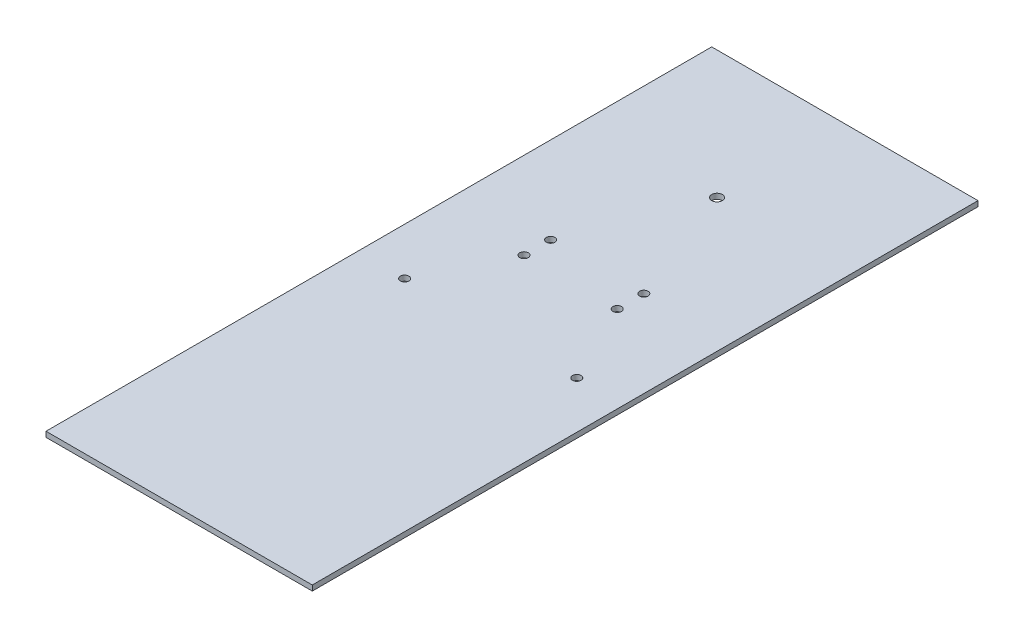
ISO-10303-21;
HEADER;
FILE_DESCRIPTION(('STEP AP214'),'2;1');
FILE_NAME('part.step','',(''),(''),'','','');
FILE_SCHEMA(('AUTOMOTIVE_DESIGN { 1 0 10303 214 1 1 1 1 }'));
ENDSEC;
DATA;
#1=APPLICATION_CONTEXT('core data for automotive mechanical design processes');
#2=APPLICATION_PROTOCOL_DEFINITION('international standard','automotive_design',2000,#1);
#3=PRODUCT_CONTEXT('',#1,'mechanical');
#4=PRODUCT('Part','Part','',(#3));
#5=PRODUCT_RELATED_PRODUCT_CATEGORY('part','',(#4));
#6=PRODUCT_DEFINITION_FORMATION('','',#4);
#7=PRODUCT_DEFINITION_CONTEXT('part definition',#1,'design');
#8=PRODUCT_DEFINITION('design','',#6,#7);
#9=PRODUCT_DEFINITION_SHAPE('','',#8);
#10=(LENGTH_UNIT() NAMED_UNIT(*) SI_UNIT(.MILLI.,.METRE.));
#11=(NAMED_UNIT(*) PLANE_ANGLE_UNIT() SI_UNIT($,.RADIAN.));
#12=(NAMED_UNIT(*) SI_UNIT($,.STERADIAN.) SOLID_ANGLE_UNIT());
#13=UNCERTAINTY_MEASURE_WITH_UNIT(LENGTH_MEASURE(1.E-05),#10,'distance_accuracy_value','');
#14=(GEOMETRIC_REPRESENTATION_CONTEXT(3) GLOBAL_UNCERTAINTY_ASSIGNED_CONTEXT((#13)) GLOBAL_UNIT_ASSIGNED_CONTEXT((#10,
#11,#12)) REPRESENTATION_CONTEXT('',''));
#15=CARTESIAN_POINT('',(0.,0.,0.));
#16=DIRECTION('',(0.,0.,1.));
#17=DIRECTION('',(1.,0.,0.));
#18=AXIS2_PLACEMENT_3D('',#15,#16,#17);
#19=CARTESIAN_POINT('',(50.,2.,200.));
#20=DIRECTION('',(-1.,0.,0.));
#21=DIRECTION('',(0.,0.,1.));
#22=AXIS2_PLACEMENT_3D('',#19,#20,#21);
#23=PLANE('',#22);
#24=DIRECTION('',(0.,0.,-1.));
#25=VECTOR('',#24,1.);
#26=CARTESIAN_POINT('',(50.,2.,200.));
#27=LINE('',#26,#25);
#28=CARTESIAN_POINT('',(50.,2.,50.));
#29=VERTEX_POINT('',#28);
#30=CARTESIAN_POINT('',(50.,2.,-200.));
#31=VERTEX_POINT('',#30);
#32=EDGE_CURVE('E88',#29,#31,#27,.T.);
#33=ORIENTED_EDGE('',*,*,#32,.F.);
#34=DIRECTION('',(0.,-1.,0.));
#35=VECTOR('',#34,1.);
#36=CARTESIAN_POINT('',(50.,2.001,50.));
#37=LINE('',#36,#35);
#38=CARTESIAN_POINT('',(50.,0.,50.));
#39=VERTEX_POINT('',#38);
#40=EDGE_CURVE('E139',#29,#39,#37,.T.);
#41=ORIENTED_EDGE('',*,*,#40,.T.);
#42=DIRECTION('',(0.,0.,-1.));
#43=VECTOR('',#42,1.);
#44=CARTESIAN_POINT('',(50.,0.,200.));
#45=LINE('',#44,#43);
#46=CARTESIAN_POINT('',(50.,0.,-200.));
#47=VERTEX_POINT('',#46);
#48=EDGE_CURVE('E79',#39,#47,#45,.T.);
#49=ORIENTED_EDGE('',*,*,#48,.T.);
#50=DIRECTION('',(0.,-1.,0.));
#51=VECTOR('',#50,1.);
#52=CARTESIAN_POINT('',(50.,2.,-200.));
#53=LINE('',#52,#51);
#54=EDGE_CURVE('E11',#31,#47,#53,.T.);
#55=ORIENTED_EDGE('',*,*,#54,.F.);
#56=EDGE_LOOP('',(#33,#41,#49,#55));
#57=FACE_BOUND('',#56,.T.);
#58=ADVANCED_FACE('F35',(#57),#23,.F.);
#59=CARTESIAN_POINT('',(-50.,2.,-200.));
#60=DIRECTION('',(0.,0.,1.));
#61=DIRECTION('',(1.,0.,0.));
#62=AXIS2_PLACEMENT_3D('',#59,#60,#61);
#63=PLANE('',#62);
#64=DIRECTION('',(-1.,0.,0.));
#65=VECTOR('',#64,1.);
#66=CARTESIAN_POINT('',(-50.,0.,-200.));
#67=LINE('',#66,#65);
#68=CARTESIAN_POINT('',(-50.,0.,-200.));
#69=VERTEX_POINT('',#68);
#70=EDGE_CURVE('E70',#47,#69,#67,.T.);
#71=ORIENTED_EDGE('',*,*,#70,.T.);
#72=DIRECTION('',(0.,-1.,0.));
#73=VECTOR('',#72,1.);
#74=CARTESIAN_POINT('',(-50.,2.,-200.));
#75=LINE('',#74,#73);
#76=CARTESIAN_POINT('',(-50.,2.,-200.));
#77=VERTEX_POINT('',#76);
#78=EDGE_CURVE('E42',#77,#69,#75,.T.);
#79=ORIENTED_EDGE('',*,*,#78,.F.);
#80=DIRECTION('',(-1.,0.,0.));
#81=VECTOR('',#80,1.);
#82=CARTESIAN_POINT('',(-50.,2.,-200.));
#83=LINE('',#82,#81);
#84=EDGE_CURVE('E58',#31,#77,#83,.T.);
#85=ORIENTED_EDGE('',*,*,#84,.F.);
#86=ORIENTED_EDGE('',*,*,#54,.T.);
#87=EDGE_LOOP('',(#71,#79,#85,#86));
#88=FACE_BOUND('',#87,.T.);
#89=ADVANCED_FACE('F72',(#88),#63,.F.);
#90=CARTESIAN_POINT('',(-50.,2.,200.));
#91=DIRECTION('',(1.,0.,0.));
#92=DIRECTION('',(0.,0.,-1.));
#93=AXIS2_PLACEMENT_3D('',#90,#91,#92);
#94=PLANE('',#93);
#95=DIRECTION('',(0.,0.,1.));
#96=VECTOR('',#95,1.);
#97=CARTESIAN_POINT('',(-50.,0.,200.));
#98=LINE('',#97,#96);
#99=CARTESIAN_POINT('',(-50.,0.,50.));
#100=VERTEX_POINT('',#99);
#101=EDGE_CURVE('E78',#69,#100,#98,.T.);
#102=ORIENTED_EDGE('',*,*,#101,.T.);
#103=DIRECTION('',(0.,-1.,0.));
#104=VECTOR('',#103,1.);
#105=CARTESIAN_POINT('',(-50.,2.001,50.));
#106=LINE('',#105,#104);
#107=CARTESIAN_POINT('',(-50.,2.,50.));
#108=VERTEX_POINT('',#107);
#109=EDGE_CURVE('E49',#108,#100,#106,.T.);
#110=ORIENTED_EDGE('',*,*,#109,.F.);
#111=DIRECTION('',(0.,0.,1.));
#112=VECTOR('',#111,1.);
#113=CARTESIAN_POINT('',(-50.,2.,200.));
#114=LINE('',#113,#112);
#115=EDGE_CURVE('E84',#77,#108,#114,.T.);
#116=ORIENTED_EDGE('',*,*,#115,.F.);
#117=ORIENTED_EDGE('',*,*,#78,.T.);
#118=EDGE_LOOP('',(#102,#110,#116,#117));
#119=FACE_BOUND('',#118,.T.);
#120=ADVANCED_FACE('F83',(#119),#94,.F.);
#121=CARTESIAN_POINT('',(0.,2.,0.));
#122=DIRECTION('',(0.,-1.,0.));
#123=DIRECTION('',(0.,0.,-1.));
#124=AXIS2_PLACEMENT_3D('',#121,#122,#123);
#125=PLANE('',#124);
#126=CARTESIAN_POINT('',(-32.32051615,2.,-66.9999999999996));
#127=DIRECTION('',(0.,-1.,0.));
#128=DIRECTION('',(0.,0.,-1.));
#129=AXIS2_PLACEMENT_3D('',#126,#127,#128);
#130=CIRCLE('',#129,1.60000000000001);
#131=CARTESIAN_POINT('',(-32.32051615,2.,-68.5999999999996));
#132=VERTEX_POINT('',#131);
#133=EDGE_CURVE('E108',#132,#132,#130,.F.);
#134=ORIENTED_EDGE('',*,*,#133,.F.);
#135=EDGE_LOOP('',(#134));
#136=FACE_BOUND('',#135,.T.);
#137=CARTESIAN_POINT('',(-17.5,2.,-107.));
#138=DIRECTION('',(0.,-1.,0.));
#139=DIRECTION('',(0.,0.,-1.));
#140=AXIS2_PLACEMENT_3D('',#137,#138,#139);
#141=CIRCLE('',#140,1.60000000000001);
#142=CARTESIAN_POINT('',(-17.5,2.,-108.6));
#143=VERTEX_POINT('',#142);
#144=EDGE_CURVE('E116',#143,#143,#141,.F.);
#145=ORIENTED_EDGE('',*,*,#144,.F.);
#146=EDGE_LOOP('',(#145));
#147=FACE_BOUND('',#146,.T.);
#148=CARTESIAN_POINT('',(-17.5,2.,-96.9999999999996));
#149=DIRECTION('',(0.,-1.,0.));
#150=DIRECTION('',(0.,0.,-1.));
#151=AXIS2_PLACEMENT_3D('',#148,#149,#150);
#152=CIRCLE('',#151,1.60000000000001);
#153=CARTESIAN_POINT('',(-17.5,2.,-98.5999999999996));
#154=VERTEX_POINT('',#153);
#155=EDGE_CURVE('E122',#154,#154,#152,.F.);
#156=ORIENTED_EDGE('',*,*,#155,.F.);
#157=EDGE_LOOP('',(#156));
#158=FACE_BOUND('',#157,.T.);
#159=CARTESIAN_POINT('',(32.32051615,2.,-66.9999999999996));
#160=DIRECTION('',(0.,-1.,0.));
#161=DIRECTION('',(0.,0.,-1.));
#162=AXIS2_PLACEMENT_3D('',#159,#160,#161);
#163=CIRCLE('',#162,1.60000000000002);
#164=CARTESIAN_POINT('',(32.32051615,2.,-68.5999999999996));
#165=VERTEX_POINT('',#164);
#166=EDGE_CURVE('E128',#165,#165,#163,.F.);
#167=ORIENTED_EDGE('',*,*,#166,.F.);
#168=EDGE_LOOP('',(#167));
#169=FACE_BOUND('',#168,.T.);
#170=CARTESIAN_POINT('',(17.5,2.,-107.));
#171=DIRECTION('',(0.,-1.,0.));
#172=DIRECTION('',(0.,0.,-1.));
#173=AXIS2_PLACEMENT_3D('',#170,#171,#172);
#174=CIRCLE('',#173,1.60000000000001);
#175=CARTESIAN_POINT('',(17.5,2.,-108.6));
#176=VERTEX_POINT('',#175);
#177=EDGE_CURVE('E107',#176,#176,#174,.F.);
#178=ORIENTED_EDGE('',*,*,#177,.F.);
#179=EDGE_LOOP('',(#178));
#180=FACE_BOUND('',#179,.T.);
#181=CARTESIAN_POINT('',(17.5,2.,-96.9999999999996));
#182=DIRECTION('',(0.,-1.,0.));
#183=DIRECTION('',(0.,0.,-1.));
#184=AXIS2_PLACEMENT_3D('',#181,#182,#183);
#185=CIRCLE('',#184,1.60000000000001);
#186=CARTESIAN_POINT('',(17.5,2.,-98.5999999999996));
#187=VERTEX_POINT('',#186);
#188=EDGE_CURVE('E101',#187,#187,#185,.F.);
#189=ORIENTED_EDGE('',*,*,#188,.F.);
#190=EDGE_LOOP('',(#189));
#191=FACE_BOUND('',#190,.T.);
#192=CARTESIAN_POINT('',(0.,2.,-152.));
#193=DIRECTION('',(0.,-1.,0.));
#194=DIRECTION('',(0.,0.,-1.));
#195=AXIS2_PLACEMENT_3D('',#192,#193,#194);
#196=CIRCLE('',#195,2.);
#197=CARTESIAN_POINT('',(0.,2.,-154.));
#198=VERTEX_POINT('',#197);
#199=EDGE_CURVE('E93',#198,#198,#196,.F.);
#200=ORIENTED_EDGE('',*,*,#199,.F.);
#201=EDGE_LOOP('',(#200));
#202=FACE_BOUND('',#201,.T.);
#203=ORIENTED_EDGE('',*,*,#115,.T.);
#204=DIRECTION('',(-1.,0.,0.));
#205=VECTOR('',#204,1.);
#206=CARTESIAN_POINT('',(-50.,2.,50.));
#207=LINE('',#206,#205);
#208=EDGE_CURVE('E115',#29,#108,#207,.T.);
#209=ORIENTED_EDGE('',*,*,#208,.F.);
#210=ORIENTED_EDGE('',*,*,#32,.T.);
#211=ORIENTED_EDGE('',*,*,#84,.T.);
#212=EDGE_LOOP('',(#203,#209,#210,#211));
#213=FACE_BOUND('',#212,.T.);
#214=ADVANCED_FACE('F151',(#136,#147,#158,#169,#180,#191,#202,#213),#125,.F.);
#215=CARTESIAN_POINT('',(0.,0.,0.));
#216=DIRECTION('',(0.,-1.,0.));
#217=DIRECTION('',(0.,0.,-1.));
#218=AXIS2_PLACEMENT_3D('',#215,#216,#217);
#219=PLANE('',#218);
#220=DIRECTION('',(1.,0.,0.));
#221=VECTOR('',#220,1.);
#222=CARTESIAN_POINT('',(-50.,0.,50.));
#223=LINE('',#222,#221);
#224=EDGE_CURVE('E87',#100,#39,#223,.T.);
#225=ORIENTED_EDGE('',*,*,#224,.F.);
#226=ORIENTED_EDGE('',*,*,#101,.F.);
#227=ORIENTED_EDGE('',*,*,#70,.F.);
#228=ORIENTED_EDGE('',*,*,#48,.F.);
#229=EDGE_LOOP('',(#225,#226,#227,#228));
#230=FACE_BOUND('',#229,.T.);
#231=CARTESIAN_POINT('',(-32.32051615,0.,-66.9999999999996));
#232=DIRECTION('',(0.,-1.,0.));
#233=DIRECTION('',(0.,0.,-1.));
#234=AXIS2_PLACEMENT_3D('',#231,#232,#233);
#235=CIRCLE('',#234,1.60000000000001);
#236=CARTESIAN_POINT('',(-32.32051615,0.,-68.5999999999996));
#237=VERTEX_POINT('',#236);
#238=EDGE_CURVE('E112',#237,#237,#235,.T.);
#239=ORIENTED_EDGE('',*,*,#238,.F.);
#240=EDGE_LOOP('',(#239));
#241=FACE_BOUND('',#240,.T.);
#242=CARTESIAN_POINT('',(-17.5,0.,-107.));
#243=DIRECTION('',(0.,-1.,0.));
#244=DIRECTION('',(0.,0.,-1.));
#245=AXIS2_PLACEMENT_3D('',#242,#243,#244);
#246=CIRCLE('',#245,1.60000000000001);
#247=CARTESIAN_POINT('',(-17.5,0.,-108.6));
#248=VERTEX_POINT('',#247);
#249=EDGE_CURVE('E111',#248,#248,#246,.T.);
#250=ORIENTED_EDGE('',*,*,#249,.F.);
#251=EDGE_LOOP('',(#250));
#252=FACE_BOUND('',#251,.T.);
#253=CARTESIAN_POINT('',(-17.5,0.,-96.9999999999996));
#254=DIRECTION('',(0.,-1.,0.));
#255=DIRECTION('',(0.,0.,-1.));
#256=AXIS2_PLACEMENT_3D('',#253,#254,#255);
#257=CIRCLE('',#256,1.60000000000001);
#258=CARTESIAN_POINT('',(-17.5,0.,-98.5999999999996));
#259=VERTEX_POINT('',#258);
#260=EDGE_CURVE('E119',#259,#259,#257,.T.);
#261=ORIENTED_EDGE('',*,*,#260,.F.);
#262=EDGE_LOOP('',(#261));
#263=FACE_BOUND('',#262,.T.);
#264=CARTESIAN_POINT('',(32.32051615,0.,-66.9999999999996));
#265=DIRECTION('',(0.,-1.,0.));
#266=DIRECTION('',(0.,0.,-1.));
#267=AXIS2_PLACEMENT_3D('',#264,#265,#266);
#268=CIRCLE('',#267,1.60000000000002);
#269=CARTESIAN_POINT('',(32.32051615,0.,-68.5999999999996));
#270=VERTEX_POINT('',#269);
#271=EDGE_CURVE('E125',#270,#270,#268,.T.);
#272=ORIENTED_EDGE('',*,*,#271,.F.);
#273=EDGE_LOOP('',(#272));
#274=FACE_BOUND('',#273,.T.);
#275=CARTESIAN_POINT('',(17.5,0.,-107.));
#276=DIRECTION('',(0.,-1.,0.));
#277=DIRECTION('',(0.,0.,-1.));
#278=AXIS2_PLACEMENT_3D('',#275,#276,#277);
#279=CIRCLE('',#278,1.60000000000001);
#280=CARTESIAN_POINT('',(17.5,0.,-108.6));
#281=VERTEX_POINT('',#280);
#282=EDGE_CURVE('E131',#281,#281,#279,.T.);
#283=ORIENTED_EDGE('',*,*,#282,.F.);
#284=EDGE_LOOP('',(#283));
#285=FACE_BOUND('',#284,.T.);
#286=CARTESIAN_POINT('',(17.5,0.,-96.9999999999996));
#287=DIRECTION('',(0.,-1.,0.));
#288=DIRECTION('',(0.,0.,-1.));
#289=AXIS2_PLACEMENT_3D('',#286,#287,#288);
#290=CIRCLE('',#289,1.60000000000001);
#291=CARTESIAN_POINT('',(17.5,0.,-98.5999999999996));
#292=VERTEX_POINT('',#291);
#293=EDGE_CURVE('E104',#292,#292,#290,.T.);
#294=ORIENTED_EDGE('',*,*,#293,.F.);
#295=EDGE_LOOP('',(#294));
#296=FACE_BOUND('',#295,.T.);
#297=CARTESIAN_POINT('',(0.,0.,-152.));
#298=DIRECTION('',(0.,-1.,0.));
#299=DIRECTION('',(0.,0.,-1.));
#300=AXIS2_PLACEMENT_3D('',#297,#298,#299);
#301=CIRCLE('',#300,2.);
#302=CARTESIAN_POINT('',(0.,0.,-154.));
#303=VERTEX_POINT('',#302);
#304=EDGE_CURVE('E98',#303,#303,#301,.T.);
#305=ORIENTED_EDGE('',*,*,#304,.F.);
#306=EDGE_LOOP('',(#305));
#307=FACE_BOUND('',#306,.T.);
#308=ADVANCED_FACE('F85',(#230,#241,#252,#263,#274,#285,#296,#307),#219,.T.);
#309=CARTESIAN_POINT('',(0.,2.001,-152.));
#310=DIRECTION('',(0.,-1.,0.));
#311=DIRECTION('',(0.,0.,-1.));
#312=AXIS2_PLACEMENT_3D('',#309,#310,#311);
#313=CYLINDRICAL_SURFACE('',#312,2.);
#314=ORIENTED_EDGE('',*,*,#304,.T.);
#315=EDGE_LOOP('',(#314));
#316=FACE_BOUND('',#315,.T.);
#317=ORIENTED_EDGE('',*,*,#199,.T.);
#318=EDGE_LOOP('',(#317));
#319=FACE_BOUND('',#318,.T.);
#320=ADVANCED_FACE('F160',(#316,#319),#313,.F.);
#321=CARTESIAN_POINT('',(17.5,2.001,-96.9999999999996));
#322=DIRECTION('',(0.,-1.,0.));
#323=DIRECTION('',(0.,0.,-1.));
#324=AXIS2_PLACEMENT_3D('',#321,#322,#323);
#325=CYLINDRICAL_SURFACE('',#324,1.60000000000001);
#326=ORIENTED_EDGE('',*,*,#293,.T.);
#327=EDGE_LOOP('',(#326));
#328=FACE_BOUND('',#327,.T.);
#329=ORIENTED_EDGE('',*,*,#188,.T.);
#330=EDGE_LOOP('',(#329));
#331=FACE_BOUND('',#330,.T.);
#332=ADVANCED_FACE('F199',(#328,#331),#325,.F.);
#333=CARTESIAN_POINT('',(17.5,2.001,-107.));
#334=DIRECTION('',(0.,-1.,0.));
#335=DIRECTION('',(0.,0.,-1.));
#336=AXIS2_PLACEMENT_3D('',#333,#334,#335);
#337=CYLINDRICAL_SURFACE('',#336,1.60000000000001);
#338=ORIENTED_EDGE('',*,*,#282,.T.);
#339=EDGE_LOOP('',(#338));
#340=FACE_BOUND('',#339,.T.);
#341=ORIENTED_EDGE('',*,*,#177,.T.);
#342=EDGE_LOOP('',(#341));
#343=FACE_BOUND('',#342,.T.);
#344=ADVANCED_FACE('F205',(#340,#343),#337,.F.);
#345=CARTESIAN_POINT('',(32.32051615,2.001,-66.9999999999996));
#346=DIRECTION('',(0.,-1.,0.));
#347=DIRECTION('',(0.,0.,-1.));
#348=AXIS2_PLACEMENT_3D('',#345,#346,#347);
#349=CYLINDRICAL_SURFACE('',#348,1.60000000000002);
#350=ORIENTED_EDGE('',*,*,#271,.T.);
#351=EDGE_LOOP('',(#350));
#352=FACE_BOUND('',#351,.T.);
#353=ORIENTED_EDGE('',*,*,#166,.T.);
#354=EDGE_LOOP('',(#353));
#355=FACE_BOUND('',#354,.T.);
#356=ADVANCED_FACE('F213',(#352,#355),#349,.F.);
#357=CARTESIAN_POINT('',(-17.5,2.001,-96.9999999999996));
#358=DIRECTION('',(0.,-1.,0.));
#359=DIRECTION('',(0.,0.,-1.));
#360=AXIS2_PLACEMENT_3D('',#357,#358,#359);
#361=CYLINDRICAL_SURFACE('',#360,1.60000000000001);
#362=ORIENTED_EDGE('',*,*,#260,.T.);
#363=EDGE_LOOP('',(#362));
#364=FACE_BOUND('',#363,.T.);
#365=ORIENTED_EDGE('',*,*,#155,.T.);
#366=EDGE_LOOP('',(#365));
#367=FACE_BOUND('',#366,.T.);
#368=ADVANCED_FACE('F221',(#364,#367),#361,.F.);
#369=CARTESIAN_POINT('',(-17.5,2.001,-107.));
#370=DIRECTION('',(0.,-1.,0.));
#371=DIRECTION('',(0.,0.,-1.));
#372=AXIS2_PLACEMENT_3D('',#369,#370,#371);
#373=CYLINDRICAL_SURFACE('',#372,1.60000000000001);
#374=ORIENTED_EDGE('',*,*,#249,.T.);
#375=EDGE_LOOP('',(#374));
#376=FACE_BOUND('',#375,.T.);
#377=ORIENTED_EDGE('',*,*,#144,.T.);
#378=EDGE_LOOP('',(#377));
#379=FACE_BOUND('',#378,.T.);
#380=ADVANCED_FACE('F229',(#376,#379),#373,.F.);
#381=CARTESIAN_POINT('',(-32.32051615,2.001,-66.9999999999996));
#382=DIRECTION('',(0.,-1.,0.));
#383=DIRECTION('',(0.,0.,-1.));
#384=AXIS2_PLACEMENT_3D('',#381,#382,#383);
#385=CYLINDRICAL_SURFACE('',#384,1.60000000000001);
#386=ORIENTED_EDGE('',*,*,#238,.T.);
#387=EDGE_LOOP('',(#386));
#388=FACE_BOUND('',#387,.T.);
#389=ORIENTED_EDGE('',*,*,#133,.T.);
#390=EDGE_LOOP('',(#389));
#391=FACE_BOUND('',#390,.T.);
#392=ADVANCED_FACE('F237',(#388,#391),#385,.F.);
#393=CARTESIAN_POINT('',(-50.,2.001,50.));
#394=DIRECTION('',(0.,0.,-1.));
#395=DIRECTION('',(-1.,0.,0.));
#396=AXIS2_PLACEMENT_3D('',#393,#394,#395);
#397=PLANE('',#396);
#398=ORIENTED_EDGE('',*,*,#208,.T.);
#399=ORIENTED_EDGE('',*,*,#109,.T.);
#400=ORIENTED_EDGE('',*,*,#224,.T.);
#401=ORIENTED_EDGE('',*,*,#40,.F.);
#402=EDGE_LOOP('',(#398,#399,#400,#401));
#403=FACE_BOUND('',#402,.T.);
#404=ADVANCED_FACE('F145',(#403),#397,.F.);
#405=CLOSED_SHELL('',(#58,#89,#120,#214,#308,#320,#332,#344,#356,#368,#380,#392,#404));
#406=MANIFOLD_SOLID_BREP('B2',#405);
#407=ADVANCED_BREP_SHAPE_REPRESENTATION('',(#18,#406),#14);
#408=SHAPE_DEFINITION_REPRESENTATION(#9,#407);
ENDSEC;
END-ISO-10303-21;
